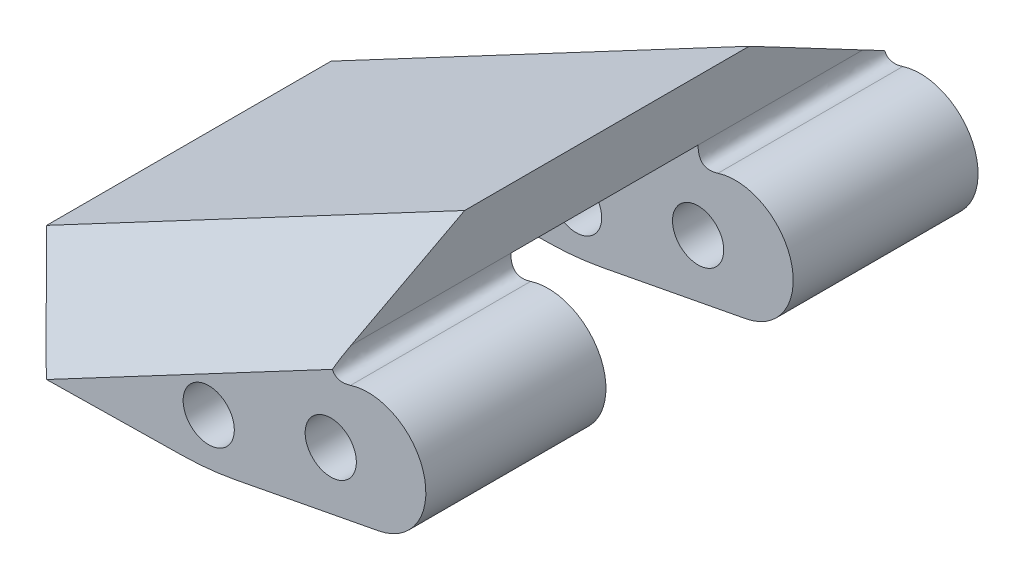
ISO-10303-21;
HEADER;
FILE_DESCRIPTION(('STEP AP214'),'2;1');
FILE_NAME('part.step','',(''),(''),'','','');
FILE_SCHEMA(('AUTOMOTIVE_DESIGN { 1 0 10303 214 1 1 1 1 }'));
ENDSEC;
DATA;
#1=APPLICATION_CONTEXT('core data for automotive mechanical design processes');
#2=APPLICATION_PROTOCOL_DEFINITION('international standard','automotive_design',2000,#1);
#3=PRODUCT_CONTEXT('',#1,'mechanical');
#4=PRODUCT('Part','Part','',(#3));
#5=PRODUCT_RELATED_PRODUCT_CATEGORY('part','',(#4));
#6=PRODUCT_DEFINITION_FORMATION('','',#4);
#7=PRODUCT_DEFINITION_CONTEXT('part definition',#1,'design');
#8=PRODUCT_DEFINITION('design','',#6,#7);
#9=PRODUCT_DEFINITION_SHAPE('','',#8);
#10=(LENGTH_UNIT() NAMED_UNIT(*) SI_UNIT(.MILLI.,.METRE.));
#11=(NAMED_UNIT(*) PLANE_ANGLE_UNIT() SI_UNIT($,.RADIAN.));
#12=(NAMED_UNIT(*) SI_UNIT($,.STERADIAN.) SOLID_ANGLE_UNIT());
#13=UNCERTAINTY_MEASURE_WITH_UNIT(LENGTH_MEASURE(1.E-05),#10,'distance_accuracy_value','');
#14=(GEOMETRIC_REPRESENTATION_CONTEXT(3) GLOBAL_UNCERTAINTY_ASSIGNED_CONTEXT((#13)) GLOBAL_UNIT_ASSIGNED_CONTEXT((#10,
#11,#12)) REPRESENTATION_CONTEXT('',''));
#15=CARTESIAN_POINT('',(0.,0.,0.));
#16=DIRECTION('',(0.,0.,1.));
#17=DIRECTION('',(1.,0.,0.));
#18=AXIS2_PLACEMENT_3D('',#15,#16,#17);
#19=CARTESIAN_POINT('',(12.9065388968002,6.1566289388395,0.));
#20=DIRECTION('',(0.,0.,1.));
#21=DIRECTION('',(1.,0.,0.));
#22=AXIS2_PLACEMENT_3D('',#19,#20,#21);
#23=PLANE('',#22);
#24=CARTESIAN_POINT('',(7.61757759133625,2.10566676631256,0.));
#25=DIRECTION('',(0.,0.,1.));
#26=DIRECTION('',(1.,0.,0.));
#27=AXIS2_PLACEMENT_3D('',#24,#25,#26);
#28=CIRCLE('',#27,1.0668);
#29=CARTESIAN_POINT('',(8.68437759133625,2.10566676631256,0.));
#30=VERTEX_POINT('',#29);
#31=EDGE_CURVE('E362',#30,#30,#28,.T.);
#32=ORIENTED_EDGE('',*,*,#31,.T.);
#33=EDGE_LOOP('',(#32));
#34=FACE_BOUND('',#33,.T.);
#35=CARTESIAN_POINT('',(12.7,3.48183865819149,0.));
#36=DIRECTION('',(0.,0.,1.));
#37=DIRECTION('',(1.,0.,0.));
#38=AXIS2_PLACEMENT_3D('',#35,#36,#37);
#39=CIRCLE('',#38,1.0668);
#40=CARTESIAN_POINT('',(13.7668,3.48183865819149,0.));
#41=VERTEX_POINT('',#40);
#42=EDGE_CURVE('E281',#41,#41,#39,.T.);
#43=ORIENTED_EDGE('',*,*,#42,.T.);
#44=EDGE_LOOP('',(#43));
#45=FACE_BOUND('',#44,.T.);
#46=DIRECTION('',(0.999877374480242,0.0156600128511543,0.));
#47=VECTOR('',#46,1.);
#48=CARTESIAN_POINT('',(0.,0.,0.));
#49=LINE('',#48,#47);
#50=CARTESIAN_POINT('',(4.63804044691818,0.0726406806041272,0.));
#51=VERTEX_POINT('',#50);
#52=CARTESIAN_POINT('',(6.51937385713765,0.102105999185476,0.));
#53=VERTEX_POINT('',#52);
#54=EDGE_CURVE('E185',#51,#53,#49,.T.);
#55=ORIENTED_EDGE('',*,*,#54,.F.);
#56=CARTESIAN_POINT('',(4.61131426668728,1.77908263395049,0.));
#57=DIRECTION('',(0.,0.,1.));
#58=DIRECTION('',(1.,0.,0.));
#59=AXIS2_PLACEMENT_3D('',#56,#57,#58);
#60=CIRCLE('',#59,1.70665123234078);
#61=CARTESIAN_POINT('',(3.99507315309353,3.37059302309881,0.));
#62=VERTEX_POINT('',#61);
#63=EDGE_CURVE('E166',#51,#62,#60,.F.);
#64=ORIENTED_EDGE('',*,*,#63,.T.);
#65=DIRECTION('',(-0.932534052060222,-0.361082042959968,0.));
#66=VECTOR('',#65,1.);
#67=CARTESIAN_POINT('',(12.7,6.74118604622101,0.));
#68=LINE('',#67,#66);
#69=CARTESIAN_POINT('',(12.7,6.74118604622101,0.));
#70=VERTEX_POINT('',#69);
#71=EDGE_CURVE('E349',#70,#62,#68,.T.);
#72=ORIENTED_EDGE('',*,*,#71,.F.);
#73=CARTESIAN_POINT('',(591883.302227409,806039.769758924,0.));
#74=CARTESIAN_POINT('',(-591158.633176823,-806539.694907194,0.));
#75=CARTESIAN_POINT('',(590485.590281825,807064.246571218,0.));
#76=B_SPLINE_CURVE_WITH_KNOTS('',2,(#73,#74,#75),.UNSPECIFIED.,.F.,.F.,(3,3),(0.,1.),.UNSPECIFIED.);
#77=CARTESIAN_POINT('',(13.5261555874853,6.13564121608059,0.));
#78=VERTEX_POINT('',#77);
#79=EDGE_CURVE('E194',#78,#70,#76,.T.);
#80=ORIENTED_EDGE('',*,*,#79,.F.);
#81=CARTESIAN_POINT('',(14.2514925137212,3.83791070514326,0.));
#82=DIRECTION('',(0.,0.,1.));
#83=DIRECTION('',(-1.,0.,0.));
#84=AXIS2_PLACEMENT_3D('',#81,#82,#83);
#85=CIRCLE('',#84,2.40949769816322);
#86=CARTESIAN_POINT('',(14.703179452878,1.47112848730201,0.));
#87=VERTEX_POINT('',#86);
#88=EDGE_CURVE('E211',#87,#78,#85,.T.);
#89=ORIENTED_EDGE('',*,*,#88,.F.);
#90=DIRECTION('',(0.98227203935345,0.187461037830304,0.));
#91=VECTOR('',#90,1.);
#92=CARTESIAN_POINT('',(8.70124687437288,0.325693755295727,0.));
#93=LINE('',#92,#91);
#94=CARTESIAN_POINT('',(8.70124687225493,0.325693755081791,0.));
#95=VERTEX_POINT('',#94);
#96=EDGE_CURVE('E196',#95,#87,#93,.T.);
#97=ORIENTED_EDGE('',*,*,#96,.F.);
#98=CARTESIAN_POINT('',(-106937.891807334,994277.775575892,0.));
#99=CARTESIAN_POINT('',(101948.908377259,-994790.249866016,0.));
#100=CARTESIAN_POINT('',(-96929.4643264566,995303.39064376,0.));
#101=B_SPLINE_CURVE_WITH_KNOTS('',2,(#98,#99,#100),.UNSPECIFIED.,.F.,.F.,(3,3),(0.,1.),.UNSPECIFIED.);
#102=EDGE_CURVE('E193',#53,#95,#101,.T.);
#103=ORIENTED_EDGE('',*,*,#102,.F.);
#104=EDGE_LOOP('',(#55,#64,#72,#80,#89,#97,#103));
#105=FACE_BOUND('',#104,.T.);
#106=ADVANCED_FACE('F43',(#34,#45,#105),#23,.F.);
#107=CARTESIAN_POINT('',(12.9065388968002,6.1566289388395,7.5));
#108=DIRECTION('',(0.,0.,1.));
#109=DIRECTION('',(1.,0.,0.));
#110=AXIS2_PLACEMENT_3D('',#107,#108,#109);
#111=PLANE('',#110);
#112=CARTESIAN_POINT('',(591883.302227409,806039.769758924,7.5));
#113=CARTESIAN_POINT('',(-591158.633176823,-806539.694907194,7.5));
#114=CARTESIAN_POINT('',(590485.590281825,807064.246571218,7.5));
#115=B_SPLINE_CURVE_WITH_KNOTS('',2,(#112,#113,#114),.UNSPECIFIED.,.F.,.F.,(3,3),(0.,1.),.UNSPECIFIED.);
#116=CARTESIAN_POINT('',(13.5261555874853,6.13564121608059,7.5));
#117=VERTEX_POINT('',#116);
#118=CARTESIAN_POINT('',(12.7691242881369,6.33430206389707,7.5));
#119=VERTEX_POINT('',#118);
#120=EDGE_CURVE('E213',#117,#119,#115,.T.);
#121=ORIENTED_EDGE('',*,*,#120,.T.);
#122=DIRECTION('',(-0.883279596534531,-0.468846621344119,0.));
#123=VECTOR('',#122,1.);
#124=CARTESIAN_POINT('',(-3.49085247825782,-2.29652695098979,7.5));
#125=LINE('',#124,#123);
#126=CARTESIAN_POINT('',(0.861076979150518,0.0134861303030682,7.5));
#127=VERTEX_POINT('',#126);
#128=EDGE_CURVE('E237',#119,#127,#125,.T.);
#129=ORIENTED_EDGE('',*,*,#128,.T.);
#130=DIRECTION('',(0.999877374480242,0.0156600128511543,0.));
#131=VECTOR('',#130,1.);
#132=CARTESIAN_POINT('',(0.,0.,7.5));
#133=LINE('',#132,#131);
#134=CARTESIAN_POINT('',(6.51937385713765,0.102105999185476,7.5));
#135=VERTEX_POINT('',#134);
#136=EDGE_CURVE('E280',#127,#135,#133,.T.);
#137=ORIENTED_EDGE('',*,*,#136,.T.);
#138=CARTESIAN_POINT('',(-106937.891807334,994277.775575892,7.5));
#139=CARTESIAN_POINT('',(101948.908377259,-994790.249866016,7.5));
#140=CARTESIAN_POINT('',(-96929.4643264566,995303.39064376,7.5));
#141=B_SPLINE_CURVE_WITH_KNOTS('',2,(#138,#139,#140),.UNSPECIFIED.,.F.,.F.,(3,3),(0.,1.),.UNSPECIFIED.);
#142=CARTESIAN_POINT('',(8.70124687225493,0.325693755081791,7.5));
#143=VERTEX_POINT('',#142);
#144=EDGE_CURVE('E287',#135,#143,#141,.T.);
#145=ORIENTED_EDGE('',*,*,#144,.T.);
#146=DIRECTION('',(0.98227203935345,0.187461037830304,0.));
#147=VECTOR('',#146,1.);
#148=CARTESIAN_POINT('',(8.70124687437288,0.325693755295727,7.5));
#149=LINE('',#148,#147);
#150=CARTESIAN_POINT('',(14.703179452878,1.47112848730201,7.5));
#151=VERTEX_POINT('',#150);
#152=EDGE_CURVE('E292',#143,#151,#149,.T.);
#153=ORIENTED_EDGE('',*,*,#152,.T.);
#154=CARTESIAN_POINT('',(14.2514925137212,3.83791070514326,7.5));
#155=DIRECTION('',(0.,0.,1.));
#156=DIRECTION('',(-1.,0.,0.));
#157=AXIS2_PLACEMENT_3D('',#154,#155,#156);
#158=CIRCLE('',#157,2.40949769816322);
#159=EDGE_CURVE('E218',#151,#117,#158,.T.);
#160=ORIENTED_EDGE('',*,*,#159,.T.);
#161=EDGE_LOOP('',(#121,#129,#137,#145,#153,#160));
#162=FACE_BOUND('',#161,.T.);
#163=CARTESIAN_POINT('',(12.7,3.48183865819149,7.5));
#164=DIRECTION('',(0.,0.,1.));
#165=DIRECTION('',(1.,0.,0.));
#166=AXIS2_PLACEMENT_3D('',#163,#164,#165);
#167=CIRCLE('',#166,1.0668);
#168=CARTESIAN_POINT('',(13.7668,3.48183865819149,7.5));
#169=VERTEX_POINT('',#168);
#170=EDGE_CURVE('E199',#169,#169,#167,.T.);
#171=ORIENTED_EDGE('',*,*,#170,.F.);
#172=EDGE_LOOP('',(#171));
#173=FACE_BOUND('',#172,.T.);
#174=CARTESIAN_POINT('',(7.61757759133625,2.10566676631256,7.5));
#175=DIRECTION('',(0.,0.,1.));
#176=DIRECTION('',(1.,0.,0.));
#177=AXIS2_PLACEMENT_3D('',#174,#175,#176);
#178=CIRCLE('',#177,1.0668);
#179=CARTESIAN_POINT('',(8.68437759133625,2.10566676631256,7.5));
#180=VERTEX_POINT('',#179);
#181=EDGE_CURVE('E363',#180,#180,#178,.T.);
#182=ORIENTED_EDGE('',*,*,#181,.F.);
#183=EDGE_LOOP('',(#182));
#184=FACE_BOUND('',#183,.T.);
#185=ADVANCED_FACE('F271',(#162,#173,#184),#111,.T.);
#186=DIRECTION('',(0.,0.,-1.));
#187=VECTOR('',#186,1.);
#188=SURFACE_OF_LINEAR_EXTRUSION('',#115,#187);
#189=DIRECTION('',(0.,0.,-1.));
#190=VECTOR('',#189,1.);
#191=CARTESIAN_POINT('',(12.7,6.74118604622101,7.5));
#192=LINE('',#191,#190);
#193=CARTESIAN_POINT('',(12.7,6.74118604622101,6.65978002546812));
#194=VERTEX_POINT('',#193);
#195=EDGE_CURVE('E235',#194,#70,#192,.T.);
#196=ORIENTED_EDGE('',*,*,#195,.F.);
#197=CARTESIAN_POINT('',(12.7,6.74118604622101,6.65978002546812));
#198=CARTESIAN_POINT('',(12.700009867066,6.71185753874385,6.71534398187369));
#199=CARTESIAN_POINT('',(12.7007112319901,6.68281182342107,6.77106753655538));
#200=CARTESIAN_POINT('',(12.7037594756446,6.6254029452277,6.88287622894422));
#201=CARTESIAN_POINT('',(12.7061076942648,6.59704035760261,6.93896162420702));
#202=CARTESIAN_POINT('',(12.7126988944381,6.54128226769278,7.05120564201453));
#203=CARTESIAN_POINT('',(12.7169337405294,6.51388315232524,7.10736292869983));
#204=CARTESIAN_POINT('',(12.7276401520697,6.46012977048859,7.21994724808333));
#205=CARTESIAN_POINT('',(12.7341108748491,6.4337751145431,7.27637417126945));
#206=CARTESIAN_POINT('',(12.7457602580676,6.39544084193953,7.36069973209453));
#207=CARTESIAN_POINT('',(12.7499228321936,6.38296598455977,7.38851483564331));
#208=CARTESIAN_POINT('',(12.7589672654573,6.35836115310254,7.4442149664504));
#209=CARTESIAN_POINT('',(12.7638498552865,6.34623154448911,7.47210003611702));
#210=CARTESIAN_POINT('',(12.7691242881435,6.3343020638824,7.50000000002802));
#211=B_SPLINE_CURVE_WITH_KNOTS('',3,(#197,#198,#199,#200,#201,#202,#203,#204,#205,#206,#207,
#208,#209,#210),.UNSPECIFIED.,.F.,.F.,(4,2,2,2,2,2,4),(0.,0.188497107939841,0.377147756409041,
0.564992668647259,0.752766861924204,0.845059629583986,0.9374467113606),.UNSPECIFIED.);
#212=EDGE_CURVE('E256',#194,#119,#211,.T.);
#213=ORIENTED_EDGE('',*,*,#212,.T.);
#214=ORIENTED_EDGE('',*,*,#120,.F.);
#215=DIRECTION('',(0.,0.,-1.));
#216=VECTOR('',#215,1.);
#217=CARTESIAN_POINT('',(13.5261555874853,6.13564121608059,7.5));
#218=LINE('',#217,#216);
#219=EDGE_CURVE('E214',#117,#78,#218,.T.);
#220=ORIENTED_EDGE('',*,*,#219,.T.);
#221=ORIENTED_EDGE('',*,*,#79,.T.);
#222=EDGE_LOOP('',(#196,#213,#214,#220,#221));
#223=FACE_BOUND('',#222,.T.);
#224=ADVANCED_FACE('F265',(#223),#188,.F.);
#225=CARTESIAN_POINT('',(12.7,6.74118604622101,7.5));
#226=DIRECTION('',(-1.,-2.41640041312254E-11,0.));
#227=DIRECTION('',(2.41640041312254E-11,-1.,0.));
#228=AXIS2_PLACEMENT_3D('',#225,#226,#227);
#229=PLANE('',#228);
#230=DIRECTION('',(0.,0.,-1.));
#231=VECTOR('',#230,1.);
#232=CARTESIAN_POINT('',(12.6999999999396,9.24118604619423,7.5));
#233=LINE('',#232,#231);
#234=CARTESIAN_POINT('',(12.6999999999396,9.24118604619423,1.92428200667515));
#235=VERTEX_POINT('',#234);
#236=CARTESIAN_POINT('',(12.6999999999396,9.24118604619423,-9.92428200667516));
#237=VERTEX_POINT('',#236);
#238=EDGE_CURVE('E232',#235,#237,#233,.T.);
#239=ORIENTED_EDGE('',*,*,#238,.F.);
#240=DIRECTION('',(1.12812608115616E-11,-0.466862228225811,0.884330062734515));
#241=VECTOR('',#240,1.);
#242=CARTESIAN_POINT('',(12.7000000000104,6.30949878990361,7.47748168428857));
#243=LINE('',#242,#241);
#244=EDGE_CURVE('E254',#235,#194,#243,.T.);
#245=ORIENTED_EDGE('',*,*,#244,.T.);
#246=ORIENTED_EDGE('',*,*,#195,.T.);
#247=DIRECTION('',(0.,0.,1.));
#248=VECTOR('',#247,1.);
#249=CARTESIAN_POINT('',(12.7,6.74118604622101,-7.8));
#250=LINE('',#249,#248);
#251=CARTESIAN_POINT('',(12.7,6.74118604622101,-7.8));
#252=VERTEX_POINT('',#251);
#253=EDGE_CURVE('E355',#252,#70,#250,.T.);
#254=ORIENTED_EDGE('',*,*,#253,.F.);
#255=DIRECTION('',(0.,0.,1.));
#256=VECTOR('',#255,1.);
#257=CARTESIAN_POINT('',(12.6999999998993,6.74118604663021,-15.5));
#258=LINE('',#257,#256);
#259=CARTESIAN_POINT('',(12.6999999998993,6.74118604663021,-14.6597800245918));
#260=VERTEX_POINT('',#259);
#261=EDGE_CURVE('E457',#260,#252,#258,.T.);
#262=ORIENTED_EDGE('',*,*,#261,.F.);
#263=DIRECTION('',(-1.12812608115616E-11,0.466862228225811,0.884330062734515));
#264=VECTOR('',#263,1.);
#265=CARTESIAN_POINT('',(12.7000000000104,6.30949878991371,-15.4774816842694));
#266=LINE('',#265,#264);
#267=EDGE_CURVE('E252',#260,#237,#266,.T.);
#268=ORIENTED_EDGE('',*,*,#267,.T.);
#269=EDGE_LOOP('',(#239,#245,#246,#254,#262,#268));
#270=FACE_BOUND('',#269,.T.);
#271=ADVANCED_FACE('F270',(#270),#229,.F.);
#272=CARTESIAN_POINT('',(12.6999999999396,9.24118604619423,7.5));
#273=DIRECTION('',(0.468846621344119,-0.883279596534531,0.));
#274=DIRECTION('',(0.883279596534531,0.468846621344119,0.));
#275=AXIS2_PLACEMENT_3D('',#272,#273,#274);
#276=PLANE('',#275);
#277=DIRECTION('',(0.,0.,-1.));
#278=VECTOR('',#277,1.);
#279=CARTESIAN_POINT('',(-4.70985369375253,0.,7.5));
#280=LINE('',#279,#278);
#281=CARTESIAN_POINT('',(-4.70985369375253,0.,1.92428200667515));
#282=VERTEX_POINT('',#281);
#283=CARTESIAN_POINT('',(-4.70985369375253,0.,-9.92428200667516));
#284=VERTEX_POINT('',#283);
#285=EDGE_CURVE('E229',#282,#284,#280,.T.);
#286=ORIENTED_EDGE('',*,*,#285,.F.);
#287=DIRECTION('',(0.883279596534531,0.468846621344119,0.));
#288=VECTOR('',#287,1.);
#289=CARTESIAN_POINT('',(12.6999999999396,9.24118604619423,1.92428200667515));
#290=LINE('',#289,#288);
#291=EDGE_CURVE('E250',#282,#235,#290,.T.);
#292=ORIENTED_EDGE('',*,*,#291,.T.);
#293=ORIENTED_EDGE('',*,*,#238,.T.);
#294=DIRECTION('',(-0.883279596534531,-0.468846621344119,0.));
#295=VECTOR('',#294,1.);
#296=CARTESIAN_POINT('',(-4.70985369375253,0.,-9.92428200667516));
#297=LINE('',#296,#295);
#298=EDGE_CURVE('E248',#237,#284,#297,.T.);
#299=ORIENTED_EDGE('',*,*,#298,.T.);
#300=EDGE_LOOP('',(#286,#292,#293,#299));
#301=FACE_BOUND('',#300,.T.);
#302=ADVANCED_FACE('F308',(#301),#276,.F.);
#303=CARTESIAN_POINT('',(-4.70985369375253,0.,7.5));
#304=DIRECTION('',(0.,1.,0.));
#305=DIRECTION('',(0.,0.,1.));
#306=AXIS2_PLACEMENT_3D('',#303,#304,#305);
#307=PLANE('',#306);
#308=DIRECTION('',(0.,0.,-1.));
#309=VECTOR('',#308,1.);
#310=CARTESIAN_POINT('',(0.,0.,7.5));
#311=LINE('',#310,#309);
#312=CARTESIAN_POINT('',(0.,0.,6.65978002546812));
#313=VERTEX_POINT('',#312);
#314=CARTESIAN_POINT('',(0.,0.,-14.6597800254681));
#315=VERTEX_POINT('',#314);
#316=EDGE_CURVE('E226',#313,#315,#311,.T.);
#317=ORIENTED_EDGE('',*,*,#316,.F.);
#318=DIRECTION('',(-0.705184372595703,0.,-0.709023977483699));
#319=VECTOR('',#318,1.);
#320=CARTESIAN_POINT('',(6.78672147862411,0.,13.4834540089625));
#321=LINE('',#320,#319);
#322=EDGE_CURVE('E246',#313,#282,#321,.T.);
#323=ORIENTED_EDGE('',*,*,#322,.T.);
#324=ORIENTED_EDGE('',*,*,#285,.T.);
#325=DIRECTION('',(0.705184372595703,0.,-0.709023977483699));
#326=VECTOR('',#325,1.);
#327=CARTESIAN_POINT('',(6.78672147866753,0.,-21.4834540090062));
#328=LINE('',#327,#326);
#329=EDGE_CURVE('E244',#284,#315,#328,.T.);
#330=ORIENTED_EDGE('',*,*,#329,.T.);
#331=EDGE_LOOP('',(#317,#323,#324,#330));
#332=FACE_BOUND('',#331,.T.);
#333=ADVANCED_FACE('F306',(#332),#307,.F.);
#334=CARTESIAN_POINT('',(0.,0.,7.5));
#335=DIRECTION('',(-0.0156600128511543,0.999877374480242,0.));
#336=DIRECTION('',(-0.999877374480242,-0.0156600128511543,0.));
#337=AXIS2_PLACEMENT_3D('',#334,#335,#336);
#338=PLANE('',#337);
#339=ORIENTED_EDGE('',*,*,#136,.F.);
#340=DIRECTION('',(-0.715676792629625,-0.0112088822648665,-0.698341670996186));
#341=VECTOR('',#340,1.);
#342=CARTESIAN_POINT('',(7.02837216054692,0.110077896716158,13.5179109716248));
#343=LINE('',#342,#341);
#344=EDGE_CURVE('E242',#127,#313,#343,.T.);
#345=ORIENTED_EDGE('',*,*,#344,.T.);
#346=ORIENTED_EDGE('',*,*,#316,.T.);
#347=DIRECTION('',(0.715676792629625,0.0112088822648665,-0.698341670996186));
#348=VECTOR('',#347,1.);
#349=CARTESIAN_POINT('',(7.02837216059202,0.110077896716865,-21.5179109716688));
#350=LINE('',#349,#348);
#351=CARTESIAN_POINT('',(0.861076979150515,0.0134861303030681,-15.5));
#352=VERTEX_POINT('',#351);
#353=EDGE_CURVE('E240',#315,#352,#350,.T.);
#354=ORIENTED_EDGE('',*,*,#353,.T.);
#355=DIRECTION('',(-0.999877374480242,-0.0156600128511543,0.));
#356=VECTOR('',#355,1.);
#357=CARTESIAN_POINT('',(6.51937385713765,0.102105999185476,-15.5));
#358=LINE('',#357,#356);
#359=CARTESIAN_POINT('',(6.5193738592586,0.102105999169162,-15.5));
#360=VERTEX_POINT('',#359);
#361=EDGE_CURVE('E413',#360,#352,#358,.T.);
#362=ORIENTED_EDGE('',*,*,#361,.F.);
#363=DIRECTION('',(0.,0.,1.));
#364=VECTOR('',#363,1.);
#365=CARTESIAN_POINT('',(6.5193738592586,0.102105999169162,-15.5));
#366=LINE('',#365,#364);
#367=CARTESIAN_POINT('',(6.5193738592586,0.102105999169162,-7.8));
#368=VERTEX_POINT('',#367);
#369=EDGE_CURVE('E446',#360,#368,#366,.T.);
#370=ORIENTED_EDGE('',*,*,#369,.T.);
#371=DIRECTION('',(-0.999877374480242,-0.0156600128511543,0.));
#372=VECTOR('',#371,1.);
#373=CARTESIAN_POINT('',(6.51937385713765,0.102105999185476,-7.8));
#374=LINE('',#373,#372);
#375=CARTESIAN_POINT('',(4.63804044691818,0.0726406806041268,-7.8));
#376=VERTEX_POINT('',#375);
#377=EDGE_CURVE('E189',#368,#376,#374,.T.);
#378=ORIENTED_EDGE('',*,*,#377,.T.);
#379=DIRECTION('',(0.,0.,1.));
#380=VECTOR('',#379,1.);
#381=CARTESIAN_POINT('',(4.63804044691818,0.0726406806041272,-25.9275119156144));
#382=LINE('',#381,#380);
#383=EDGE_CURVE('E169',#376,#51,#382,.T.);
#384=ORIENTED_EDGE('',*,*,#383,.T.);
#385=ORIENTED_EDGE('',*,*,#54,.T.);
#386=DIRECTION('',(0.,0.,-1.));
#387=VECTOR('',#386,1.);
#388=CARTESIAN_POINT('',(6.51937385713765,0.102105999185476,7.5));
#389=LINE('',#388,#387);
#390=EDGE_CURVE('E224',#135,#53,#389,.T.);
#391=ORIENTED_EDGE('',*,*,#390,.F.);
#392=EDGE_LOOP('',(#339,#345,#346,#354,#362,#370,#378,#384,#385,#391));
#393=FACE_BOUND('',#392,.T.);
#394=ADVANCED_FACE('F183',(#393),#338,.F.);
#395=DIRECTION('',(0.,0.,-1.));
#396=VECTOR('',#395,1.);
#397=SURFACE_OF_LINEAR_EXTRUSION('',#141,#396);
#398=ORIENTED_EDGE('',*,*,#102,.T.);
#399=DIRECTION('',(0.,0.,-1.));
#400=VECTOR('',#399,1.);
#401=CARTESIAN_POINT('',(8.70124687225493,0.325693755081791,7.5));
#402=LINE('',#401,#400);
#403=EDGE_CURVE('E221',#143,#95,#402,.T.);
#404=ORIENTED_EDGE('',*,*,#403,.F.);
#405=ORIENTED_EDGE('',*,*,#144,.F.);
#406=ORIENTED_EDGE('',*,*,#390,.T.);
#407=EDGE_LOOP('',(#398,#404,#405,#406));
#408=FACE_BOUND('',#407,.T.);
#409=ADVANCED_FACE('F297',(#408),#397,.F.);
#410=CARTESIAN_POINT('',(8.70124687437288,0.325693755295727,7.5));
#411=DIRECTION('',(-0.187461037830304,0.98227203935345,0.));
#412=DIRECTION('',(-0.98227203935345,-0.187461037830304,0.));
#413=AXIS2_PLACEMENT_3D('',#410,#411,#412);
#414=PLANE('',#413);
#415=ORIENTED_EDGE('',*,*,#96,.T.);
#416=DIRECTION('',(0.,0.,-1.));
#417=VECTOR('',#416,1.);
#418=CARTESIAN_POINT('',(14.703179452878,1.47112848730201,7.5));
#419=LINE('',#418,#417);
#420=EDGE_CURVE('E217',#151,#87,#419,.T.);
#421=ORIENTED_EDGE('',*,*,#420,.F.);
#422=ORIENTED_EDGE('',*,*,#152,.F.);
#423=ORIENTED_EDGE('',*,*,#403,.T.);
#424=EDGE_LOOP('',(#415,#421,#422,#423));
#425=FACE_BOUND('',#424,.T.);
#426=ADVANCED_FACE('F301',(#425),#414,.F.);
#427=CARTESIAN_POINT('',(14.2514925137212,3.83791070514326,7.5));
#428=DIRECTION('',(0.,0.,-1.));
#429=DIRECTION('',(-1.,0.,0.));
#430=AXIS2_PLACEMENT_3D('',#427,#428,#429);
#431=CYLINDRICAL_SURFACE('',#430,2.40949769816322);
#432=ORIENTED_EDGE('',*,*,#88,.T.);
#433=ORIENTED_EDGE('',*,*,#219,.F.);
#434=ORIENTED_EDGE('',*,*,#159,.F.);
#435=ORIENTED_EDGE('',*,*,#420,.T.);
#436=EDGE_LOOP('',(#432,#433,#434,#435));
#437=FACE_BOUND('',#436,.T.);
#438=ADVANCED_FACE('F330',(#437),#431,.T.);
#439=CARTESIAN_POINT('',(12.7,3.48183865819149,7.5));
#440=DIRECTION('',(0.,0.,-1.));
#441=DIRECTION('',(-1.,0.,0.));
#442=AXIS2_PLACEMENT_3D('',#439,#440,#441);
#443=CYLINDRICAL_SURFACE('',#442,1.0668);
#444=ORIENTED_EDGE('',*,*,#170,.T.);
#445=EDGE_LOOP('',(#444));
#446=FACE_BOUND('',#445,.T.);
#447=ORIENTED_EDGE('',*,*,#42,.F.);
#448=EDGE_LOOP('',(#447));
#449=FACE_BOUND('',#448,.T.);
#450=ADVANCED_FACE('F332',(#446,#449),#443,.F.);
#451=CARTESIAN_POINT('',(7.61757759133625,2.10566676631256,7.5));
#452=DIRECTION('',(0.,0.,-1.));
#453=DIRECTION('',(-1.,0.,0.));
#454=AXIS2_PLACEMENT_3D('',#451,#452,#453);
#455=CYLINDRICAL_SURFACE('',#454,1.0668);
#456=ORIENTED_EDGE('',*,*,#181,.T.);
#457=EDGE_LOOP('',(#456));
#458=FACE_BOUND('',#457,.T.);
#459=ORIENTED_EDGE('',*,*,#31,.F.);
#460=EDGE_LOOP('',(#459));
#461=FACE_BOUND('',#460,.T.);
#462=ADVANCED_FACE('F338',(#458,#461),#455,.F.);
#463=CARTESIAN_POINT('',(12.7,6.74118604622101,-7.8));
#464=DIRECTION('',(-0.361082042959968,0.932534052060222,0.));
#465=DIRECTION('',(-0.932534052060222,-0.361082042959968,0.));
#466=AXIS2_PLACEMENT_3D('',#463,#464,#465);
#467=PLANE('',#466);
#468=ORIENTED_EDGE('',*,*,#71,.T.);
#469=DIRECTION('',(0.,0.,1.));
#470=VECTOR('',#469,1.);
#471=CARTESIAN_POINT('',(3.99507315309353,3.37059302309881,-25.9275119156144));
#472=LINE('',#471,#470);
#473=CARTESIAN_POINT('',(3.99507315309353,3.37059302309881,-7.8));
#474=VERTEX_POINT('',#473);
#475=EDGE_CURVE('E172',#474,#62,#472,.T.);
#476=ORIENTED_EDGE('',*,*,#475,.F.);
#477=DIRECTION('',(-0.932534052060222,-0.361082042959968,0.));
#478=VECTOR('',#477,1.);
#479=CARTESIAN_POINT('',(12.7,6.74118604622101,-7.8));
#480=LINE('',#479,#478);
#481=EDGE_CURVE('E351',#252,#474,#480,.T.);
#482=ORIENTED_EDGE('',*,*,#481,.F.);
#483=ORIENTED_EDGE('',*,*,#253,.T.);
#484=EDGE_LOOP('',(#468,#476,#482,#483));
#485=FACE_BOUND('',#484,.T.);
#486=ADVANCED_FACE('F377',(#485),#467,.F.);
#487=CARTESIAN_POINT('',(12.9065388969423,6.15662893878266,-7.8));
#488=DIRECTION('',(0.,0.,-1.));
#489=DIRECTION('',(-1.,0.,0.));
#490=AXIS2_PLACEMENT_3D('',#487,#488,#489);
#491=PLANE('',#490);
#492=CARTESIAN_POINT('',(12.7,3.48183865819149,-7.8));
#493=DIRECTION('',(0.,0.,-1.));
#494=DIRECTION('',(-1.,0.,0.));
#495=AXIS2_PLACEMENT_3D('',#492,#493,#494);
#496=CIRCLE('',#495,1.0668);
#497=CARTESIAN_POINT('',(13.7668,3.48183865819149,-7.8));
#498=VERTEX_POINT('',#497);
#499=EDGE_CURVE('E400',#498,#498,#496,.T.);
#500=ORIENTED_EDGE('',*,*,#499,.T.);
#501=EDGE_LOOP('',(#500));
#502=FACE_BOUND('',#501,.T.);
#503=CARTESIAN_POINT('',(7.61757759133625,2.10566676631256,-7.8));
#504=DIRECTION('',(0.,0.,-1.));
#505=DIRECTION('',(-1.,0.,0.));
#506=AXIS2_PLACEMENT_3D('',#503,#504,#505);
#507=CIRCLE('',#506,1.0668);
#508=CARTESIAN_POINT('',(8.68437759133625,2.10566676631256,-7.8));
#509=VERTEX_POINT('',#508);
#510=EDGE_CURVE('E177',#509,#509,#507,.T.);
#511=ORIENTED_EDGE('',*,*,#510,.T.);
#512=EDGE_LOOP('',(#511));
#513=FACE_BOUND('',#512,.T.);
#514=ORIENTED_EDGE('',*,*,#481,.T.);
#515=CARTESIAN_POINT('',(4.61131426668728,1.77908263395049,-7.8));
#516=DIRECTION('',(0.,0.,-1.));
#517=DIRECTION('',(-1.,0.,0.));
#518=AXIS2_PLACEMENT_3D('',#515,#516,#517);
#519=CIRCLE('',#518,1.70665123234078);
#520=EDGE_CURVE('E178',#474,#376,#519,.F.);
#521=ORIENTED_EDGE('',*,*,#520,.T.);
#522=ORIENTED_EDGE('',*,*,#377,.F.);
#523=CARTESIAN_POINT('',(-96929.4643264564,995303.390643759,-7.8));
#524=CARTESIAN_POINT('',(101948.908377264,-994790.249866015,-7.8));
#525=CARTESIAN_POINT('',(-106937.891807346,994277.775575891,-7.8));
#526=B_SPLINE_CURVE_WITH_KNOTS('',2,(#523,#524,#525),.UNSPECIFIED.,.F.,.F.,(3,3),(0.,1.),.UNSPECIFIED.);
#527=CARTESIAN_POINT('',(8.70124687016838,0.325693754712281,-7.8));
#528=VERTEX_POINT('',#527);
#529=EDGE_CURVE('E442',#528,#368,#526,.T.);
#530=ORIENTED_EDGE('',*,*,#529,.F.);
#531=DIRECTION('',(-0.982272039360048,-0.187461037795729,0.));
#532=VECTOR('',#531,1.);
#533=CARTESIAN_POINT('',(14.703179452878,1.47112848730201,-7.8));
#534=LINE('',#533,#532);
#535=CARTESIAN_POINT('',(14.7031794528693,1.47112848734739,-7.8));
#536=VERTEX_POINT('',#535);
#537=EDGE_CURVE('E434',#536,#528,#534,.T.);
#538=ORIENTED_EDGE('',*,*,#537,.F.);
#539=CARTESIAN_POINT('',(14.2514925137212,3.83791070514326,-7.8));
#540=DIRECTION('',(0.,0.,-1.));
#541=DIRECTION('',(-1.,0.,0.));
#542=AXIS2_PLACEMENT_3D('',#539,#540,#541);
#543=CIRCLE('',#542,2.40949769816693);
#544=CARTESIAN_POINT('',(13.5261555867624,6.1356412158563,-7.8));
#545=VERTEX_POINT('',#544);
#546=EDGE_CURVE('E443',#545,#536,#543,.T.);
#547=ORIENTED_EDGE('',*,*,#546,.F.);
#548=CARTESIAN_POINT('',(590485.590281823,807064.246571219,-7.8));
#549=CARTESIAN_POINT('',(-591158.63317682,-806539.694907196,-7.8));
#550=CARTESIAN_POINT('',(591883.302227405,806039.769758928,-7.8));
#551=B_SPLINE_CURVE_WITH_KNOTS('',2,(#548,#549,#550),.UNSPECIFIED.,.F.,.F.,(3,3),(0.,1.),.UNSPECIFIED.);
#552=EDGE_CURVE('E482',#252,#545,#551,.T.);
#553=ORIENTED_EDGE('',*,*,#552,.F.);
#554=EDGE_LOOP('',(#514,#521,#522,#530,#538,#547,#553));
#555=FACE_BOUND('',#554,.T.);
#556=ADVANCED_FACE('F383',(#502,#513,#555),#491,.F.);
#557=CARTESIAN_POINT('',(12.9065388969423,6.15662893878266,-15.5));
#558=DIRECTION('',(0.,0.,-1.));
#559=DIRECTION('',(-1.,0.,0.));
#560=AXIS2_PLACEMENT_3D('',#557,#558,#559);
#561=PLANE('',#560);
#562=ORIENTED_EDGE('',*,*,#361,.T.);
#563=DIRECTION('',(0.883279596534531,0.468846621344119,0.));
#564=VECTOR('',#563,1.);
#565=CARTESIAN_POINT('',(13.9190012154343,6.94465909520444,-15.5));
#566=LINE('',#565,#564);
#567=CARTESIAN_POINT('',(12.7691242882161,6.33430206394342,-15.5));
#568=VERTEX_POINT('',#567);
#569=EDGE_CURVE('E58',#352,#568,#566,.T.);
#570=ORIENTED_EDGE('',*,*,#569,.T.);
#571=CARTESIAN_POINT('',(590485.590281823,807064.246571219,-15.5));
#572=CARTESIAN_POINT('',(-591158.63317682,-806539.694907196,-15.5));
#573=CARTESIAN_POINT('',(591883.302227405,806039.769758928,-15.5));
#574=B_SPLINE_CURVE_WITH_KNOTS('',2,(#571,#572,#573),.UNSPECIFIED.,.F.,.F.,(3,3),(0.,1.),.UNSPECIFIED.);
#575=CARTESIAN_POINT('',(13.5261555867624,6.1356412158563,-15.5));
#576=VERTEX_POINT('',#575);
#577=EDGE_CURVE('E393',#568,#576,#574,.T.);
#578=ORIENTED_EDGE('',*,*,#577,.T.);
#579=CARTESIAN_POINT('',(14.2514925137212,3.83791070514326,-15.5));
#580=DIRECTION('',(0.,0.,-1.));
#581=DIRECTION('',(-1.,0.,0.));
#582=AXIS2_PLACEMENT_3D('',#579,#580,#581);
#583=CIRCLE('',#582,2.40949769816693);
#584=CARTESIAN_POINT('',(14.7031794528693,1.47112848734739,-15.5));
#585=VERTEX_POINT('',#584);
#586=EDGE_CURVE('E399',#576,#585,#583,.T.);
#587=ORIENTED_EDGE('',*,*,#586,.T.);
#588=DIRECTION('',(-0.982272039360048,-0.187461037795729,0.));
#589=VECTOR('',#588,1.);
#590=CARTESIAN_POINT('',(14.703179452878,1.47112848730201,-15.5));
#591=LINE('',#590,#589);
#592=CARTESIAN_POINT('',(8.70124687016838,0.325693754712281,-15.5));
#593=VERTEX_POINT('',#592);
#594=EDGE_CURVE('E406',#585,#593,#591,.T.);
#595=ORIENTED_EDGE('',*,*,#594,.T.);
#596=CARTESIAN_POINT('',(-96929.4643264564,995303.390643759,-15.5));
#597=CARTESIAN_POINT('',(101948.908377264,-994790.249866015,-15.5));
#598=CARTESIAN_POINT('',(-106937.891807346,994277.775575891,-15.5));
#599=B_SPLINE_CURVE_WITH_KNOTS('',2,(#596,#597,#598),.UNSPECIFIED.,.F.,.F.,(3,3),(0.,1.),.UNSPECIFIED.);
#600=EDGE_CURVE('E408',#593,#360,#599,.T.);
#601=ORIENTED_EDGE('',*,*,#600,.T.);
#602=EDGE_LOOP('',(#562,#570,#578,#587,#595,#601));
#603=FACE_BOUND('',#602,.T.);
#604=CARTESIAN_POINT('',(12.7,3.48183865819149,-15.5));
#605=DIRECTION('',(0.,0.,-1.));
#606=DIRECTION('',(-1.,0.,0.));
#607=AXIS2_PLACEMENT_3D('',#604,#605,#606);
#608=CIRCLE('',#607,1.0668);
#609=CARTESIAN_POINT('',(13.7668,3.48183865819149,-15.5));
#610=VERTEX_POINT('',#609);
#611=EDGE_CURVE('E484',#610,#610,#608,.T.);
#612=ORIENTED_EDGE('',*,*,#611,.F.);
#613=EDGE_LOOP('',(#612));
#614=FACE_BOUND('',#613,.T.);
#615=CARTESIAN_POINT('',(7.61757759133625,2.10566676631256,-15.5));
#616=DIRECTION('',(0.,0.,-1.));
#617=DIRECTION('',(-1.,0.,0.));
#618=AXIS2_PLACEMENT_3D('',#615,#616,#617);
#619=CIRCLE('',#618,1.0668);
#620=CARTESIAN_POINT('',(8.68437759133625,2.10566676631256,-15.5));
#621=VERTEX_POINT('',#620);
#622=EDGE_CURVE('E494',#621,#621,#619,.T.);
#623=ORIENTED_EDGE('',*,*,#622,.F.);
#624=EDGE_LOOP('',(#623));
#625=FACE_BOUND('',#624,.T.);
#626=ADVANCED_FACE('F391',(#603,#614,#625),#561,.T.);
#627=DIRECTION('',(0.,0.,1.));
#628=VECTOR('',#627,1.);
#629=SURFACE_OF_LINEAR_EXTRUSION('',#574,#628);
#630=ORIENTED_EDGE('',*,*,#577,.F.);
#631=CARTESIAN_POINT('',(12.769124287837,6.33430206377215,-15.5));
#632=CARTESIAN_POINT('',(12.758353345262,6.35873108832656,-15.4428969725733));
#633=CARTESIAN_POINT('',(12.7491839328254,6.38396929409146,-15.3858714449458));
#634=CARTESIAN_POINT('',(12.7335757903866,6.43575792339494,-15.272080338344));
#635=CARTESIAN_POINT('',(12.7271354132701,6.46230754459007,-15.2153146230854));
#636=CARTESIAN_POINT('',(12.7165161920589,6.5163662511535,-15.1022396229258));
#637=CARTESIAN_POINT('',(12.7123309796662,6.5438723987576,-15.0459294997635));
#638=CARTESIAN_POINT('',(12.7058578745165,6.59973002538091,-14.9336156776977));
#639=CARTESIAN_POINT('',(12.7035701592283,6.62808158321276,-14.8776120079426));
#640=CARTESIAN_POINT('',(12.7013809614786,6.67068799508814,-14.7947058587227));
#641=CARTESIAN_POINT('',(12.70085731736,6.68467735890241,-14.7676807215447));
#642=CARTESIAN_POINT('',(12.7001668392301,6.71281670683136,-14.7136849532601));
#643=CARTESIAN_POINT('',(12.7000002609095,6.72696679875731,-14.6867143750206));
#644=CARTESIAN_POINT('',(12.7000000000796,6.74118604670923,-14.6597800246311));
#645=B_SPLINE_CURVE_WITH_KNOTS('',3,(#631,#632,#633,#634,#635,#636,#637,#638,#639,#640,#641,
#642,#643,#644),.UNSPECIFIED.,.F.,.F.,(4,2,2,2,2,2,4),(0.,0.189038999092143,0.377963740265179,
0.5663521483373,0.754758174002123,0.84606341985686,0.937434026538291),.UNSPECIFIED.);
#646=EDGE_CURVE('E11',#568,#260,#645,.T.);
#647=ORIENTED_EDGE('',*,*,#646,.T.);
#648=ORIENTED_EDGE('',*,*,#261,.T.);
#649=ORIENTED_EDGE('',*,*,#552,.T.);
#650=DIRECTION('',(0.,0.,1.));
#651=VECTOR('',#650,1.);
#652=CARTESIAN_POINT('',(13.5261555867624,6.1356412158563,-15.5));
#653=LINE('',#652,#651);
#654=EDGE_CURVE('E352',#576,#545,#653,.T.);
#655=ORIENTED_EDGE('',*,*,#654,.F.);
#656=EDGE_LOOP('',(#630,#647,#648,#649,#655));
#657=FACE_BOUND('',#656,.T.);
#658=ADVANCED_FACE('F385',(#657),#629,.F.);
#659=CARTESIAN_POINT('',(14.2514925137212,3.83791070514326,-15.5));
#660=DIRECTION('',(0.,0.,1.));
#661=DIRECTION('',(1.,0.,0.));
#662=AXIS2_PLACEMENT_3D('',#659,#660,#661);
#663=CYLINDRICAL_SURFACE('',#662,2.40949769816693);
#664=ORIENTED_EDGE('',*,*,#546,.T.);
#665=DIRECTION('',(0.,0.,1.));
#666=VECTOR('',#665,1.);
#667=CARTESIAN_POINT('',(14.7031794528693,1.47112848734739,-15.5));
#668=LINE('',#667,#666);
#669=EDGE_CURVE('E358',#585,#536,#668,.T.);
#670=ORIENTED_EDGE('',*,*,#669,.F.);
#671=ORIENTED_EDGE('',*,*,#586,.F.);
#672=ORIENTED_EDGE('',*,*,#654,.T.);
#673=EDGE_LOOP('',(#664,#670,#671,#672));
#674=FACE_BOUND('',#673,.T.);
#675=ADVANCED_FACE('F390',(#674),#663,.T.);
#676=CARTESIAN_POINT('',(14.703179452878,1.47112848730201,-15.5));
#677=DIRECTION('',(-0.187461037795729,0.982272039360048,0.));
#678=DIRECTION('',(-0.982272039360048,-0.187461037795729,0.));
#679=AXIS2_PLACEMENT_3D('',#676,#677,#678);
#680=PLANE('',#679);
#681=ORIENTED_EDGE('',*,*,#537,.T.);
#682=DIRECTION('',(0.,0.,1.));
#683=VECTOR('',#682,1.);
#684=CARTESIAN_POINT('',(8.70124687016838,0.325693754712281,-15.5));
#685=LINE('',#684,#683);
#686=EDGE_CURVE('E437',#593,#528,#685,.T.);
#687=ORIENTED_EDGE('',*,*,#686,.F.);
#688=ORIENTED_EDGE('',*,*,#594,.F.);
#689=ORIENTED_EDGE('',*,*,#669,.T.);
#690=EDGE_LOOP('',(#681,#687,#688,#689));
#691=FACE_BOUND('',#690,.T.);
#692=ADVANCED_FACE('F423',(#691),#680,.F.);
#693=DIRECTION('',(0.,0.,1.));
#694=VECTOR('',#693,1.);
#695=SURFACE_OF_LINEAR_EXTRUSION('',#599,#694);
#696=ORIENTED_EDGE('',*,*,#529,.T.);
#697=ORIENTED_EDGE('',*,*,#369,.F.);
#698=ORIENTED_EDGE('',*,*,#600,.F.);
#699=ORIENTED_EDGE('',*,*,#686,.T.);
#700=EDGE_LOOP('',(#696,#697,#698,#699));
#701=FACE_BOUND('',#700,.T.);
#702=ADVANCED_FACE('F419',(#701),#695,.F.);
#703=CARTESIAN_POINT('',(12.7,3.48183865819149,-15.5));
#704=DIRECTION('',(0.,0.,1.));
#705=DIRECTION('',(1.,0.,0.));
#706=AXIS2_PLACEMENT_3D('',#703,#704,#705);
#707=CYLINDRICAL_SURFACE('',#706,1.0668);
#708=CARTESIAN_POINT('',(13.7668,3.48183865819149,-15.5));
#709=CARTESIAN_POINT('',(13.7668,3.48183865819149,-15.4197916666667));
#710=CARTESIAN_POINT('',(13.7668,3.48183865819149,-15.3395833333333));
#711=CARTESIAN_POINT('',(13.7668,3.48183865819149,-15.1791666666667));
#712=CARTESIAN_POINT('',(13.7668,3.48183865819149,-15.0989583333333));
#713=CARTESIAN_POINT('',(13.7668,3.48183865819149,-14.9385416666667));
#714=CARTESIAN_POINT('',(13.7668,3.48183865819149,-14.8583333333333));
#715=CARTESIAN_POINT('',(13.7668,3.48183865819149,-14.6979166666667));
#716=CARTESIAN_POINT('',(13.7668,3.48183865819149,-14.6177083333333));
#717=CARTESIAN_POINT('',(13.7668,3.48183865819149,-14.4572916666667));
#718=CARTESIAN_POINT('',(13.7668,3.48183865819149,-14.3770833333333));
#719=CARTESIAN_POINT('',(13.7668,3.48183865819149,-14.2166666666667));
#720=CARTESIAN_POINT('',(13.7668,3.48183865819149,-14.1364583333333));
#721=CARTESIAN_POINT('',(13.7668,3.48183865819149,-13.9760416666667));
#722=CARTESIAN_POINT('',(13.7668,3.48183865819149,-13.8958333333333));
#723=CARTESIAN_POINT('',(13.7668,3.48183865819149,-13.7354166666667));
#724=CARTESIAN_POINT('',(13.7668,3.48183865819149,-13.6552083333333));
#725=CARTESIAN_POINT('',(13.7668,3.48183865819149,-13.4947916666667));
#726=CARTESIAN_POINT('',(13.7668,3.48183865819149,-13.4145833333333));
#727=CARTESIAN_POINT('',(13.7668,3.48183865819149,-13.2541666666667));
#728=CARTESIAN_POINT('',(13.7668,3.48183865819149,-13.1739583333333));
#729=CARTESIAN_POINT('',(13.7668,3.48183865819149,-13.0135416666667));
#730=CARTESIAN_POINT('',(13.7668,3.48183865819149,-12.9333333333333));
#731=CARTESIAN_POINT('',(13.7668,3.48183865819149,-12.7729166666667));
#732=CARTESIAN_POINT('',(13.7668,3.48183865819149,-12.6927083333333));
#733=CARTESIAN_POINT('',(13.7668,3.48183865819149,-12.5322916666667));
#734=CARTESIAN_POINT('',(13.7668,3.48183865819149,-12.4520833333333));
#735=CARTESIAN_POINT('',(13.7668,3.48183865819149,-12.2916666666667));
#736=CARTESIAN_POINT('',(13.7668,3.48183865819149,-12.2114583333333));
#737=CARTESIAN_POINT('',(13.7668,3.48183865819149,-12.0510416666667));
#738=CARTESIAN_POINT('',(13.7668,3.48183865819149,-11.9708333333333));
#739=CARTESIAN_POINT('',(13.7668,3.48183865819149,-11.8104166666667));
#740=CARTESIAN_POINT('',(13.7668,3.48183865819149,-11.7302083333333));
#741=CARTESIAN_POINT('',(13.7668,3.48183865819149,-11.5697916666667));
#742=CARTESIAN_POINT('',(13.7668,3.48183865819149,-11.4895833333333));
#743=CARTESIAN_POINT('',(13.7668,3.48183865819149,-11.3291666666667));
#744=CARTESIAN_POINT('',(13.7668,3.48183865819149,-11.2489583333333));
#745=CARTESIAN_POINT('',(13.7668,3.48183865819149,-11.0885416666667));
#746=CARTESIAN_POINT('',(13.7668,3.48183865819149,-11.0083333333333));
#747=CARTESIAN_POINT('',(13.7668,3.48183865819149,-10.8479166666667));
#748=CARTESIAN_POINT('',(13.7668,3.48183865819149,-10.7677083333333));
#749=CARTESIAN_POINT('',(13.7668,3.48183865819149,-10.6072916666667));
#750=CARTESIAN_POINT('',(13.7668,3.48183865819149,-10.5270833333333));
#751=CARTESIAN_POINT('',(13.7668,3.48183865819149,-10.3666666666667));
#752=CARTESIAN_POINT('',(13.7668,3.48183865819149,-10.2864583333333));
#753=CARTESIAN_POINT('',(13.7668,3.48183865819149,-10.1260416666667));
#754=CARTESIAN_POINT('',(13.7668,3.48183865819149,-10.0458333333333));
#755=CARTESIAN_POINT('',(13.7668,3.48183865819149,-9.88541666666667));
#756=CARTESIAN_POINT('',(13.7668,3.48183865819149,-9.80520833333333));
#757=CARTESIAN_POINT('',(13.7668,3.48183865819149,-9.64479166666667));
#758=CARTESIAN_POINT('',(13.7668,3.48183865819149,-9.56458333333333));
#759=CARTESIAN_POINT('',(13.7668,3.48183865819149,-9.40416666666667));
#760=CARTESIAN_POINT('',(13.7668,3.48183865819149,-9.32395833333333));
#761=CARTESIAN_POINT('',(13.7668,3.48183865819149,-9.16354166666667));
#762=CARTESIAN_POINT('',(13.7668,3.48183865819149,-9.08333333333333));
#763=CARTESIAN_POINT('',(13.7668,3.48183865819149,-8.92291666666667));
#764=CARTESIAN_POINT('',(13.7668,3.48183865819149,-8.84270833333333));
#765=CARTESIAN_POINT('',(13.7668,3.48183865819149,-8.68229166666667));
#766=CARTESIAN_POINT('',(13.7668,3.48183865819149,-8.60208333333333));
#767=CARTESIAN_POINT('',(13.7668,3.48183865819149,-8.44166666666666));
#768=CARTESIAN_POINT('',(13.7668,3.48183865819149,-8.36145833333333));
#769=CARTESIAN_POINT('',(13.7668,3.48183865819149,-8.20104166666667));
#770=CARTESIAN_POINT('',(13.7668,3.48183865819149,-8.12083333333333));
#771=CARTESIAN_POINT('',(13.7668,3.48183865819149,-7.96041666666667));
#772=CARTESIAN_POINT('',(13.7668,3.48183865819149,-7.88020833333333));
#773=CARTESIAN_POINT('',(13.7668,3.48183865819149,-7.8));
#774=B_SPLINE_CURVE_WITH_KNOTS('',3,(#708,#709,#710,#711,#712,#713,#714,#715,#716,#717,#718,
#719,#720,#721,#722,#723,#724,#725,#726,#727,#728,#729,#730,#731,#732,#733,#734,#735,#736,#737,
#738,#739,#740,#741,#742,#743,#744,#745,#746,#747,#748,#749,#750,#751,#752,#753,#754,#755,#756,
#757,#758,#759,#760,#761,#762,#763,#764,#765,#766,#767,#768,#769,#770,#771,#772,#773),
.UNSPECIFIED.,.F.,.F.,(4,2,2,2,2,2,2,2,2,2,2,2,2,2,2,2,2,2,2,2,2,2,2,2,2,2,2,2,2,2,2,2,4),(0.,
0.240625000000001,0.481250000000001,0.721875,0.962500000000002,1.203125,1.44375,1.684375,1.925,
2.165625,2.40625,2.646875,2.8875,3.128125,3.36875,3.609375,3.85,4.090625,4.33125,4.571875,
4.8125,5.053125,5.29375,5.534375,5.775,6.015625,6.25625,6.496875,6.7375,6.978125,7.21875,
7.459375,7.7),.UNSPECIFIED.);
#775=EDGE_CURVE('BSEAM422',#610,#498,#774,.T.);
#776=ORIENTED_EDGE('',*,*,#611,.T.);
#777=ORIENTED_EDGE('',*,*,#499,.F.);
#778=ORIENTED_EDGE('',*,*,#775,.T.);
#779=ORIENTED_EDGE('',*,*,#775,.F.);
#780=EDGE_LOOP('',(#776,#778,#777,#779));
#781=FACE_BOUND('',#780,.T.);
#782=ADVANCED_FACE('F422',(#781),#707,.F.);
#783=CARTESIAN_POINT('',(7.61757759133625,2.10566676631256,-15.5));
#784=DIRECTION('',(0.,0.,1.));
#785=DIRECTION('',(1.,0.,0.));
#786=AXIS2_PLACEMENT_3D('',#783,#784,#785);
#787=CYLINDRICAL_SURFACE('',#786,1.0668);
#788=CARTESIAN_POINT('',(8.68437759133625,2.10566676631256,-15.5));
#789=CARTESIAN_POINT('',(8.68437759133625,2.10566676631256,-15.4197916666667));
#790=CARTESIAN_POINT('',(8.68437759133625,2.10566676631256,-15.3395833333333));
#791=CARTESIAN_POINT('',(8.68437759133625,2.10566676631256,-15.1791666666667));
#792=CARTESIAN_POINT('',(8.68437759133625,2.10566676631256,-15.0989583333333));
#793=CARTESIAN_POINT('',(8.68437759133625,2.10566676631256,-14.9385416666667));
#794=CARTESIAN_POINT('',(8.68437759133625,2.10566676631256,-14.8583333333333));
#795=CARTESIAN_POINT('',(8.68437759133625,2.10566676631256,-14.6979166666667));
#796=CARTESIAN_POINT('',(8.68437759133625,2.10566676631256,-14.6177083333333));
#797=CARTESIAN_POINT('',(8.68437759133625,2.10566676631256,-14.4572916666667));
#798=CARTESIAN_POINT('',(8.68437759133625,2.10566676631256,-14.3770833333333));
#799=CARTESIAN_POINT('',(8.68437759133625,2.10566676631256,-14.2166666666667));
#800=CARTESIAN_POINT('',(8.68437759133625,2.10566676631256,-14.1364583333333));
#801=CARTESIAN_POINT('',(8.68437759133625,2.10566676631256,-13.9760416666667));
#802=CARTESIAN_POINT('',(8.68437759133625,2.10566676631256,-13.8958333333333));
#803=CARTESIAN_POINT('',(8.68437759133625,2.10566676631256,-13.7354166666667));
#804=CARTESIAN_POINT('',(8.68437759133625,2.10566676631256,-13.6552083333333));
#805=CARTESIAN_POINT('',(8.68437759133625,2.10566676631256,-13.4947916666667));
#806=CARTESIAN_POINT('',(8.68437759133625,2.10566676631256,-13.4145833333333));
#807=CARTESIAN_POINT('',(8.68437759133625,2.10566676631256,-13.2541666666667));
#808=CARTESIAN_POINT('',(8.68437759133625,2.10566676631256,-13.1739583333333));
#809=CARTESIAN_POINT('',(8.68437759133625,2.10566676631256,-13.0135416666667));
#810=CARTESIAN_POINT('',(8.68437759133625,2.10566676631256,-12.9333333333333));
#811=CARTESIAN_POINT('',(8.68437759133625,2.10566676631256,-12.7729166666667));
#812=CARTESIAN_POINT('',(8.68437759133625,2.10566676631256,-12.6927083333333));
#813=CARTESIAN_POINT('',(8.68437759133625,2.10566676631256,-12.5322916666667));
#814=CARTESIAN_POINT('',(8.68437759133625,2.10566676631256,-12.4520833333333));
#815=CARTESIAN_POINT('',(8.68437759133625,2.10566676631256,-12.2916666666667));
#816=CARTESIAN_POINT('',(8.68437759133625,2.10566676631256,-12.2114583333333));
#817=CARTESIAN_POINT('',(8.68437759133625,2.10566676631256,-12.0510416666667));
#818=CARTESIAN_POINT('',(8.68437759133625,2.10566676631256,-11.9708333333333));
#819=CARTESIAN_POINT('',(8.68437759133625,2.10566676631256,-11.8104166666667));
#820=CARTESIAN_POINT('',(8.68437759133625,2.10566676631256,-11.7302083333333));
#821=CARTESIAN_POINT('',(8.68437759133625,2.10566676631256,-11.5697916666667));
#822=CARTESIAN_POINT('',(8.68437759133625,2.10566676631256,-11.4895833333333));
#823=CARTESIAN_POINT('',(8.68437759133625,2.10566676631256,-11.3291666666667));
#824=CARTESIAN_POINT('',(8.68437759133625,2.10566676631256,-11.2489583333333));
#825=CARTESIAN_POINT('',(8.68437759133625,2.10566676631256,-11.0885416666667));
#826=CARTESIAN_POINT('',(8.68437759133625,2.10566676631256,-11.0083333333333));
#827=CARTESIAN_POINT('',(8.68437759133625,2.10566676631256,-10.8479166666667));
#828=CARTESIAN_POINT('',(8.68437759133625,2.10566676631256,-10.7677083333333));
#829=CARTESIAN_POINT('',(8.68437759133625,2.10566676631256,-10.6072916666667));
#830=CARTESIAN_POINT('',(8.68437759133625,2.10566676631256,-10.5270833333333));
#831=CARTESIAN_POINT('',(8.68437759133625,2.10566676631256,-10.3666666666667));
#832=CARTESIAN_POINT('',(8.68437759133625,2.10566676631256,-10.2864583333333));
#833=CARTESIAN_POINT('',(8.68437759133625,2.10566676631256,-10.1260416666667));
#834=CARTESIAN_POINT('',(8.68437759133625,2.10566676631256,-10.0458333333333));
#835=CARTESIAN_POINT('',(8.68437759133625,2.10566676631256,-9.88541666666667));
#836=CARTESIAN_POINT('',(8.68437759133625,2.10566676631256,-9.80520833333333));
#837=CARTESIAN_POINT('',(8.68437759133625,2.10566676631256,-9.64479166666667));
#838=CARTESIAN_POINT('',(8.68437759133625,2.10566676631256,-9.56458333333333));
#839=CARTESIAN_POINT('',(8.68437759133625,2.10566676631256,-9.40416666666667));
#840=CARTESIAN_POINT('',(8.68437759133625,2.10566676631256,-9.32395833333333));
#841=CARTESIAN_POINT('',(8.68437759133625,2.10566676631256,-9.16354166666667));
#842=CARTESIAN_POINT('',(8.68437759133625,2.10566676631256,-9.08333333333333));
#843=CARTESIAN_POINT('',(8.68437759133625,2.10566676631256,-8.92291666666667));
#844=CARTESIAN_POINT('',(8.68437759133625,2.10566676631256,-8.84270833333333));
#845=CARTESIAN_POINT('',(8.68437759133625,2.10566676631256,-8.68229166666667));
#846=CARTESIAN_POINT('',(8.68437759133625,2.10566676631256,-8.60208333333333));
#847=CARTESIAN_POINT('',(8.68437759133625,2.10566676631256,-8.44166666666666));
#848=CARTESIAN_POINT('',(8.68437759133625,2.10566676631256,-8.36145833333333));
#849=CARTESIAN_POINT('',(8.68437759133625,2.10566676631256,-8.20104166666667));
#850=CARTESIAN_POINT('',(8.68437759133625,2.10566676631256,-8.12083333333333));
#851=CARTESIAN_POINT('',(8.68437759133625,2.10566676631256,-7.96041666666667));
#852=CARTESIAN_POINT('',(8.68437759133625,2.10566676631256,-7.88020833333333));
#853=CARTESIAN_POINT('',(8.68437759133625,2.10566676631256,-7.8));
#854=B_SPLINE_CURVE_WITH_KNOTS('',3,(#788,#789,#790,#791,#792,#793,#794,#795,#796,#797,#798,
#799,#800,#801,#802,#803,#804,#805,#806,#807,#808,#809,#810,#811,#812,#813,#814,#815,#816,#817,
#818,#819,#820,#821,#822,#823,#824,#825,#826,#827,#828,#829,#830,#831,#832,#833,#834,#835,#836,
#837,#838,#839,#840,#841,#842,#843,#844,#845,#846,#847,#848,#849,#850,#851,#852,#853),
.UNSPECIFIED.,.F.,.F.,(4,2,2,2,2,2,2,2,2,2,2,2,2,2,2,2,2,2,2,2,2,2,2,2,2,2,2,2,2,2,2,2,4),(0.,
0.240625000000001,0.481250000000001,0.721875,0.962500000000002,1.203125,1.44375,1.684375,1.925,
2.165625,2.40625,2.646875,2.8875,3.128125,3.36875,3.609375,3.85,4.090625,4.33125,4.571875,
4.8125,5.053125,5.29375,5.534375,5.775,6.015625,6.25625,6.496875,6.7375,6.978125,7.21875,
7.459375,7.7),.UNSPECIFIED.);
#855=EDGE_CURVE('BSEAM503',#621,#509,#854,.T.);
#856=ORIENTED_EDGE('',*,*,#622,.T.);
#857=ORIENTED_EDGE('',*,*,#510,.F.);
#858=ORIENTED_EDGE('',*,*,#855,.T.);
#859=ORIENTED_EDGE('',*,*,#855,.F.);
#860=EDGE_LOOP('',(#856,#858,#857,#859));
#861=FACE_BOUND('',#860,.T.);
#862=ADVANCED_FACE('F503',(#861),#787,.F.);
#863=CARTESIAN_POINT('',(4.61131426668728,1.77908263395049,-25.9275119156144));
#864=DIRECTION('',(0.,0.,1.));
#865=DIRECTION('',(1.,0.,0.));
#866=AXIS2_PLACEMENT_3D('',#863,#864,#865);
#867=CYLINDRICAL_SURFACE('',#866,1.70665123234078);
#868=ORIENTED_EDGE('',*,*,#63,.F.);
#869=ORIENTED_EDGE('',*,*,#383,.F.);
#870=ORIENTED_EDGE('',*,*,#520,.F.);
#871=ORIENTED_EDGE('',*,*,#475,.T.);
#872=EDGE_LOOP('',(#868,#869,#870,#871));
#873=FACE_BOUND('',#872,.T.);
#874=ADVANCED_FACE('F168',(#873),#867,.F.);
#875=CARTESIAN_POINT('',(12.8027543423553,6.35215296568175,7.5));
#876=DIRECTION('',(-0.424919343849998,0.800523176469836,0.422618261740701));
#877=DIRECTION('',(0.883279596534531,0.468846621344119,0.));
#878=AXIS2_PLACEMENT_3D('',#875,#876,#877);
#879=PLANE('',#878);
#880=ORIENTED_EDGE('',*,*,#244,.F.);
#881=ORIENTED_EDGE('',*,*,#291,.F.);
#882=ORIENTED_EDGE('',*,*,#322,.F.);
#883=ORIENTED_EDGE('',*,*,#344,.F.);
#884=ORIENTED_EDGE('',*,*,#128,.F.);
#885=ORIENTED_EDGE('',*,*,#212,.F.);
#886=EDGE_LOOP('',(#880,#881,#882,#883,#884,#885));
#887=FACE_BOUND('',#886,.T.);
#888=ADVANCED_FACE('F263',(#887),#879,.T.);
#889=CARTESIAN_POINT('',(12.8027543424426,6.35215296572811,-15.5));
#890=DIRECTION('',(-0.424919343849998,0.800523176469836,-0.422618261740701));
#891=DIRECTION('',(-0.883279596534531,-0.468846621344119,0.));
#892=AXIS2_PLACEMENT_3D('',#889,#890,#891);
#893=PLANE('',#892);
#894=ORIENTED_EDGE('',*,*,#329,.F.);
#895=ORIENTED_EDGE('',*,*,#298,.F.);
#896=ORIENTED_EDGE('',*,*,#267,.F.);
#897=ORIENTED_EDGE('',*,*,#646,.F.);
#898=ORIENTED_EDGE('',*,*,#569,.F.);
#899=ORIENTED_EDGE('',*,*,#353,.F.);
#900=EDGE_LOOP('',(#894,#895,#896,#897,#898,#899));
#901=FACE_BOUND('',#900,.T.);
#902=ADVANCED_FACE('F46',(#901),#893,.T.);
#903=CLOSED_SHELL('',(#106,#185,#224,#271,#302,#333,#394,#409,#426,#438,#450,#462,#486,#556,
#626,#658,#675,#692,#702,#782,#862,#874,#888,#902));
#904=MANIFOLD_SOLID_BREP('B2',#903);
#905=ADVANCED_BREP_SHAPE_REPRESENTATION('',(#18,#904),#14);
#906=SHAPE_DEFINITION_REPRESENTATION(#9,#905);
ENDSEC;
END-ISO-10303-21;
